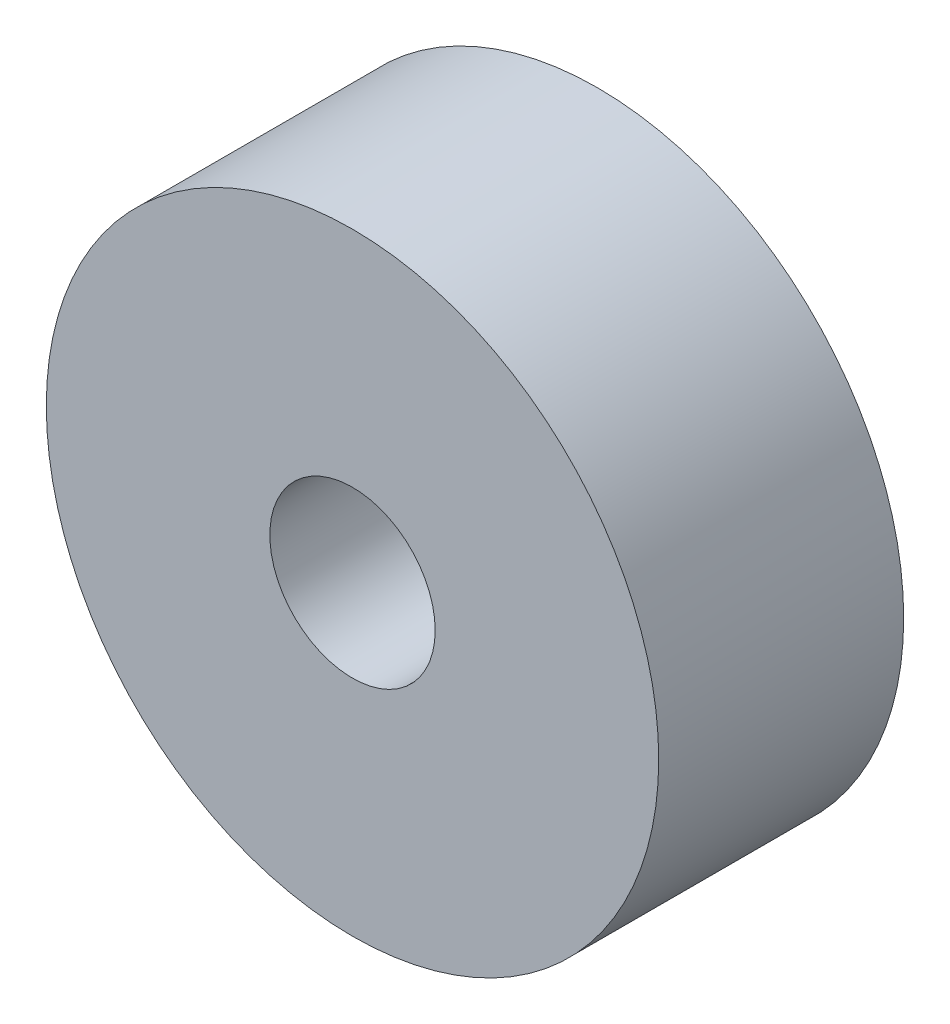
ISO-10303-21;
HEADER;
FILE_DESCRIPTION(('STEP AP214'),'2;1');
FILE_NAME('part.step','',(''),(''),'','','');
FILE_SCHEMA(('AUTOMOTIVE_DESIGN { 1 0 10303 214 1 1 1 1 }'));
ENDSEC;
DATA;
#1=APPLICATION_CONTEXT('core data for automotive mechanical design processes');
#2=APPLICATION_PROTOCOL_DEFINITION('international standard','automotive_design',2000,#1);
#3=PRODUCT_CONTEXT('',#1,'mechanical');
#4=PRODUCT('Part','Part','',(#3));
#5=PRODUCT_RELATED_PRODUCT_CATEGORY('part','',(#4));
#6=PRODUCT_DEFINITION_FORMATION('','',#4);
#7=PRODUCT_DEFINITION_CONTEXT('part definition',#1,'design');
#8=PRODUCT_DEFINITION('design','',#6,#7);
#9=PRODUCT_DEFINITION_SHAPE('','',#8);
#10=(LENGTH_UNIT() NAMED_UNIT(*) SI_UNIT(.MILLI.,.METRE.));
#11=(NAMED_UNIT(*) PLANE_ANGLE_UNIT() SI_UNIT($,.RADIAN.));
#12=(NAMED_UNIT(*) SI_UNIT($,.STERADIAN.) SOLID_ANGLE_UNIT());
#13=UNCERTAINTY_MEASURE_WITH_UNIT(LENGTH_MEASURE(1.E-05),#10,'distance_accuracy_value','');
#14=(GEOMETRIC_REPRESENTATION_CONTEXT(3) GLOBAL_UNCERTAINTY_ASSIGNED_CONTEXT((#13)) GLOBAL_UNIT_ASSIGNED_CONTEXT((#10,
#11,#12)) REPRESENTATION_CONTEXT('',''));
#15=CARTESIAN_POINT('',(0.,0.,0.));
#16=DIRECTION('',(0.,0.,1.));
#17=DIRECTION('',(1.,0.,0.));
#18=AXIS2_PLACEMENT_3D('',#15,#16,#17);
#19=CARTESIAN_POINT('',(0.,0.,20.));
#20=DIRECTION('',(0.,0.,1.));
#21=DIRECTION('',(1.,0.,0.));
#22=AXIS2_PLACEMENT_3D('',#19,#20,#21);
#23=PLANE('',#22);
#24=CARTESIAN_POINT('',(0.,0.,20.));
#25=DIRECTION('',(0.,0.,1.));
#26=DIRECTION('',(1.,0.,0.));
#27=AXIS2_PLACEMENT_3D('',#24,#25,#26);
#28=CIRCLE('',#27,25.);
#29=CARTESIAN_POINT('',(25.,0.,20.));
#30=VERTEX_POINT('',#29);
#31=EDGE_CURVE('E10',#30,#30,#28,.T.);
#32=ORIENTED_EDGE('',*,*,#31,.T.);
#33=EDGE_LOOP('',(#32));
#34=FACE_BOUND('',#33,.T.);
#35=CARTESIAN_POINT('',(0.,0.,20.));
#36=DIRECTION('',(0.,0.,1.));
#37=DIRECTION('',(1.,0.,0.));
#38=AXIS2_PLACEMENT_3D('',#35,#36,#37);
#39=CIRCLE('',#38,6.75);
#40=CARTESIAN_POINT('',(6.75,0.,20.));
#41=VERTEX_POINT('',#40);
#42=EDGE_CURVE('E51',#41,#41,#39,.T.);
#43=ORIENTED_EDGE('',*,*,#42,.F.);
#44=EDGE_LOOP('',(#43));
#45=FACE_BOUND('',#44,.T.);
#46=ADVANCED_FACE('F38',(#34,#45),#23,.T.);
#47=CARTESIAN_POINT('',(0.,0.,0.));
#48=DIRECTION('',(0.,0.,1.));
#49=DIRECTION('',(1.,0.,0.));
#50=AXIS2_PLACEMENT_3D('',#47,#48,#49);
#51=PLANE('',#50);
#52=CARTESIAN_POINT('',(0.,0.,0.));
#53=DIRECTION('',(0.,0.,1.));
#54=DIRECTION('',(1.,0.,0.));
#55=AXIS2_PLACEMENT_3D('',#52,#53,#54);
#56=CIRCLE('',#55,25.);
#57=CARTESIAN_POINT('',(25.,0.,0.));
#58=VERTEX_POINT('',#57);
#59=EDGE_CURVE('E42',#58,#58,#56,.T.);
#60=ORIENTED_EDGE('',*,*,#59,.F.);
#61=EDGE_LOOP('',(#60));
#62=FACE_BOUND('',#61,.T.);
#63=CARTESIAN_POINT('',(0.,0.,0.));
#64=DIRECTION('',(0.,0.,1.));
#65=DIRECTION('',(1.,0.,0.));
#66=AXIS2_PLACEMENT_3D('',#63,#64,#65);
#67=CIRCLE('',#66,6.75);
#68=CARTESIAN_POINT('',(6.75,0.,0.));
#69=VERTEX_POINT('',#68);
#70=EDGE_CURVE('E53',#69,#69,#67,.T.);
#71=ORIENTED_EDGE('',*,*,#70,.T.);
#72=EDGE_LOOP('',(#71));
#73=FACE_BOUND('',#72,.T.);
#74=ADVANCED_FACE('F65',(#62,#73),#51,.F.);
#75=CARTESIAN_POINT('',(0.,0.,20.));
#76=DIRECTION('',(0.,0.,-1.));
#77=DIRECTION('',(-1.,0.,0.));
#78=AXIS2_PLACEMENT_3D('',#75,#76,#77);
#79=CYLINDRICAL_SURFACE('',#78,25.);
#80=ORIENTED_EDGE('',*,*,#31,.F.);
#81=EDGE_LOOP('',(#80));
#82=FACE_BOUND('',#81,.T.);
#83=ORIENTED_EDGE('',*,*,#59,.T.);
#84=EDGE_LOOP('',(#83));
#85=FACE_BOUND('',#84,.T.);
#86=ADVANCED_FACE('F40',(#82,#85),#79,.T.);
#87=CARTESIAN_POINT('',(0.,0.,20.));
#88=DIRECTION('',(0.,0.,-1.));
#89=DIRECTION('',(-1.,0.,0.));
#90=AXIS2_PLACEMENT_3D('',#87,#88,#89);
#91=CYLINDRICAL_SURFACE('',#90,6.75);
#92=ORIENTED_EDGE('',*,*,#42,.T.);
#93=EDGE_LOOP('',(#92));
#94=FACE_BOUND('',#93,.T.);
#95=ORIENTED_EDGE('',*,*,#70,.F.);
#96=EDGE_LOOP('',(#95));
#97=FACE_BOUND('',#96,.T.);
#98=ADVANCED_FACE('F61',(#94,#97),#91,.F.);
#99=CLOSED_SHELL('',(#46,#74,#86,#98));
#100=MANIFOLD_SOLID_BREP('B2',#99);
#101=ADVANCED_BREP_SHAPE_REPRESENTATION('',(#18,#100),#14);
#102=SHAPE_DEFINITION_REPRESENTATION(#9,#101);
ENDSEC;
END-ISO-10303-21;
